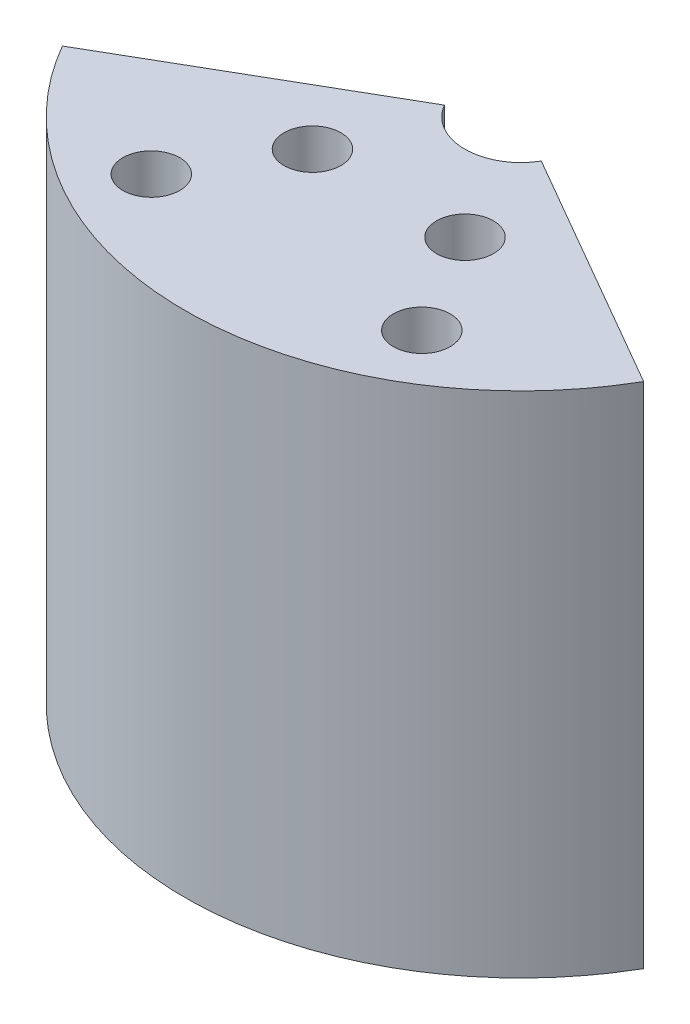
ISO-10303-21;
HEADER;
FILE_DESCRIPTION(('STEP AP214'),'2;1');
FILE_NAME('part.step','',(''),(''),'','','');
FILE_SCHEMA(('AUTOMOTIVE_DESIGN { 1 0 10303 214 1 1 1 1 }'));
ENDSEC;
DATA;
#1=APPLICATION_CONTEXT('core data for automotive mechanical design processes');
#2=APPLICATION_PROTOCOL_DEFINITION('international standard','automotive_design',2000,#1);
#3=PRODUCT_CONTEXT('',#1,'mechanical');
#4=PRODUCT('Part','Part','',(#3));
#5=PRODUCT_RELATED_PRODUCT_CATEGORY('part','',(#4));
#6=PRODUCT_DEFINITION_FORMATION('','',#4);
#7=PRODUCT_DEFINITION_CONTEXT('part definition',#1,'design');
#8=PRODUCT_DEFINITION('design','',#6,#7);
#9=PRODUCT_DEFINITION_SHAPE('','',#8);
#10=(LENGTH_UNIT() NAMED_UNIT(*) SI_UNIT(.MILLI.,.METRE.));
#11=(NAMED_UNIT(*) PLANE_ANGLE_UNIT() SI_UNIT($,.RADIAN.));
#12=(NAMED_UNIT(*) SI_UNIT($,.STERADIAN.) SOLID_ANGLE_UNIT());
#13=UNCERTAINTY_MEASURE_WITH_UNIT(LENGTH_MEASURE(1.E-05),#10,'distance_accuracy_value','');
#14=(GEOMETRIC_REPRESENTATION_CONTEXT(3) GLOBAL_UNCERTAINTY_ASSIGNED_CONTEXT((#13)) GLOBAL_UNIT_ASSIGNED_CONTEXT((#10,
#11,#12)) REPRESENTATION_CONTEXT('',''));
#15=CARTESIAN_POINT('',(0.,0.,0.));
#16=DIRECTION('',(0.,0.,1.));
#17=DIRECTION('',(1.,0.,0.));
#18=AXIS2_PLACEMENT_3D('',#15,#16,#17);
#19=CARTESIAN_POINT('',(-33.25,-123.736,57.591));
#20=DIRECTION('',(0.,1.,0.));
#21=DIRECTION('',(0.,0.,1.));
#22=AXIS2_PLACEMENT_3D('',#19,#20,#21);
#23=CYLINDRICAL_SURFACE('',#22,6.99984599830596);
#24=CARTESIAN_POINT('',(-33.25,-123.736,57.591));
#25=DIRECTION('',(0.,-1.,0.));
#26=DIRECTION('',(0.,0.,-1.));
#27=AXIS2_PLACEMENT_3D('',#24,#25,#26);
#28=CIRCLE('',#27,6.99984599830596);
#29=CARTESIAN_POINT('',(-33.25,-123.736,50.591154001694));
#30=VERTEX_POINT('',#29);
#31=EDGE_CURVE('E124',#30,#30,#28,.T.);
#32=ORIENTED_EDGE('',*,*,#31,.T.);
#33=EDGE_LOOP('',(#32));
#34=FACE_BOUND('',#33,.T.);
#35=CARTESIAN_POINT('',(-33.25,1.25599999999999,57.591));
#36=DIRECTION('',(0.,1.,0.));
#37=DIRECTION('',(-1.,0.,0.));
#38=AXIS2_PLACEMENT_3D('',#35,#36,#37);
#39=CIRCLE('',#38,6.99984599830596);
#40=CARTESIAN_POINT('',(-40.249845998306,1.25599999999999,57.591));
#41=VERTEX_POINT('',#40);
#42=EDGE_CURVE('E101',#41,#41,#39,.T.);
#43=ORIENTED_EDGE('',*,*,#42,.T.);
#44=EDGE_LOOP('',(#43));
#45=FACE_BOUND('',#44,.T.);
#46=ADVANCED_FACE('F36',(#34,#45),#23,.F.);
#47=CARTESIAN_POINT('',(-71.447,-123.736,41.25));
#48=DIRECTION('',(0.500001552615496,0.,0.866024507379608));
#49=DIRECTION('',(0.866024507379608,0.,-0.500001552615496));
#50=AXIS2_PLACEMENT_3D('',#47,#48,#49);
#51=PLANE('',#50);
#52=DIRECTION('',(-0.866024507379608,0.,0.500001552615496));
#53=VECTOR('',#52,1.);
#54=CARTESIAN_POINT('',(-71.447,1.25599999999999,41.25));
#55=LINE('',#54,#53);
#56=CARTESIAN_POINT('',(-11.908,1.256,6.875));
#57=VERTEX_POINT('',#56);
#58=CARTESIAN_POINT('',(-71.447,1.25599999999999,41.25));
#59=VERTEX_POINT('',#58);
#60=EDGE_CURVE('E83',#57,#59,#55,.T.);
#61=ORIENTED_EDGE('',*,*,#60,.F.);
#62=DIRECTION('',(0.,1.,0.));
#63=VECTOR('',#62,1.);
#64=CARTESIAN_POINT('',(-11.908,-123.736,6.875));
#65=LINE('',#64,#63);
#66=CARTESIAN_POINT('',(-11.908,-123.736,6.875));
#67=VERTEX_POINT('',#66);
#68=EDGE_CURVE('E53',#67,#57,#65,.T.);
#69=ORIENTED_EDGE('',*,*,#68,.F.);
#70=DIRECTION('',(0.866024507379608,0.,-0.500001552615496));
#71=VECTOR('',#70,1.);
#72=CARTESIAN_POINT('',(-71.447,-123.736,41.25));
#73=LINE('',#72,#71);
#74=CARTESIAN_POINT('',(-71.447,-123.736,41.25));
#75=VERTEX_POINT('',#74);
#76=EDGE_CURVE('E45',#75,#67,#73,.T.);
#77=ORIENTED_EDGE('',*,*,#76,.F.);
#78=DIRECTION('',(0.,1.,0.));
#79=VECTOR('',#78,1.);
#80=CARTESIAN_POINT('',(-71.447,-123.736,41.25));
#81=LINE('',#80,#79);
#82=EDGE_CURVE('E79',#75,#59,#81,.T.);
#83=ORIENTED_EDGE('',*,*,#82,.T.);
#84=EDGE_LOOP('',(#61,#69,#77,#83));
#85=FACE_BOUND('',#84,.T.);
#86=ADVANCED_FACE('F81',(#85),#51,.F.);
#87=CARTESIAN_POINT('',(71.447,-123.736,41.25));
#88=CARTESIAN_POINT('',(70.4179784412917,-123.736,42.9492691991551));
#89=CARTESIAN_POINT('',(68.3601225616234,-123.736,46.3474984034197));
#90=CARTESIAN_POINT('',(64.8175316162057,-123.736,51.1464276983898));
#91=CARTESIAN_POINT('',(60.9633721752455,-123.736,55.6937957428081));
#92=CARTESIAN_POINT('',(56.784268218965,-123.736,59.9470190573319));
#93=CARTESIAN_POINT('',(52.3103170379407,-123.736,63.8873868401639));
#94=CARTESIAN_POINT('',(47.5641506642531,-123.736,67.4956768649826));
#95=CARTESIAN_POINT('',(42.5700874237951,-123.736,70.7526081931362));
#96=CARTESIAN_POINT('',(37.3536374394381,-123.736,73.6398244219125));
#97=CARTESIAN_POINT('',(31.9426945070306,-123.736,76.1434120966261));
#98=CARTESIAN_POINT('',(26.3648697660876,-123.736,78.2488191827297));
#99=CARTESIAN_POINT('',(20.6500633584446,-123.736,79.9472428229244));
#100=CARTESIAN_POINT('',(14.827753312135,-123.736,81.2299744352066));
#101=CARTESIAN_POINT('',(8.92753089676732,-123.736,82.0871009758009));
#102=CARTESIAN_POINT('',(2.98111809599237,-123.736,82.517756601325));
#103=CARTESIAN_POINT('',(-2.98111809599237,-123.736,82.517756601325));
#104=CARTESIAN_POINT('',(-8.92753089676732,-123.736,82.0871009758009));
#105=CARTESIAN_POINT('',(-14.827753312135,-123.736,81.2299744352066));
#106=CARTESIAN_POINT('',(-20.6500633584446,-123.736,79.9472428229244));
#107=CARTESIAN_POINT('',(-26.3648697660876,-123.736,78.2488191827297));
#108=CARTESIAN_POINT('',(-31.9426945070306,-123.736,76.1434120966261));
#109=CARTESIAN_POINT('',(-37.3536374394382,-123.736,73.6398244219125));
#110=CARTESIAN_POINT('',(-42.5700874237951,-123.736,70.7526081931362));
#111=CARTESIAN_POINT('',(-47.5641506642531,-123.736,67.4956768649826));
#112=CARTESIAN_POINT('',(-52.3103170379407,-123.736,63.8873868401639));
#113=CARTESIAN_POINT('',(-56.784268218965,-123.736,59.9470190573319));
#114=CARTESIAN_POINT('',(-60.9633721752455,-123.736,55.6937957428081));
#115=CARTESIAN_POINT('',(-64.8175316162057,-123.736,51.1464276983898));
#116=CARTESIAN_POINT('',(-68.3601225616235,-123.736,46.3474984034197));
#117=CARTESIAN_POINT('',(-70.4179784412917,-123.736,42.9492691991551));
#118=CARTESIAN_POINT('',(-71.447,-123.736,41.25));
#119=B_SPLINE_CURVE_WITH_KNOTS('',3,(#87,#88,#89,#90,#91,#92,#93,#94,#95,#96,#97,#98,#99,#100,
#101,#102,#103,#104,#105,#106,#107,#108,#109,#110,#111,#112,#113,#114,#115,#116,#117,#118),
.UNSPECIFIED.,.F.,.F.,(4,1,1,1,1,1,1,1,1,1,1,1,1,1,1,1,1,1,1,1,1,1,1,1,1,1,1,1,1,4),(0.,
0.0344839191298283,0.0689615636667485,0.103450465991406,0.137933366239594,0.172414368090567,
0.206896205696217,0.241380971684728,0.275865520494595,0.310346020883038,0.344829100421595,
0.379311579406632,0.413791405821834,0.448274645214702,0.482761183563026,0.517238816436974,
0.551725354785297,0.586208594178166,0.620688420593368,0.655170899578405,0.689653979116962,
0.724134479505404,0.758619028315272,0.793103794303783,0.827585631909433,0.862066633760406,
0.896549534008594,0.931038436333251,0.965516080870172,1.),.UNSPECIFIED.);
#120=DIRECTION('',(0.,1.,0.));
#121=VECTOR('',#120,1.);
#122=SURFACE_OF_LINEAR_EXTRUSION('',#119,#121);
#123=CARTESIAN_POINT('',(71.447,1.25599999999998,41.25));
#124=CARTESIAN_POINT('',(70.4179784412917,1.25599999999999,42.9492691991551));
#125=CARTESIAN_POINT('',(68.3601225616234,1.25599999999999,46.3474984034197));
#126=CARTESIAN_POINT('',(64.8175316162057,1.25599999999994,51.1464276983898));
#127=CARTESIAN_POINT('',(60.9633721752455,1.25600000000001,55.6937957428081));
#128=CARTESIAN_POINT('',(56.784268218965,1.25599999999999,59.9470190573319));
#129=CARTESIAN_POINT('',(52.3103170379407,1.25599999999997,63.8873868401639));
#130=CARTESIAN_POINT('',(47.5641506642531,1.25599999999995,67.4956768649826));
#131=CARTESIAN_POINT('',(42.5700874237951,1.25599999999997,70.7526081931362));
#132=CARTESIAN_POINT('',(37.3536374394381,1.25600000000001,73.6398244219125));
#133=CARTESIAN_POINT('',(31.9426945070306,1.25599999999999,76.1434120966261));
#134=CARTESIAN_POINT('',(26.3648697660876,1.25599999999997,78.2488191827297));
#135=CARTESIAN_POINT('',(20.6500633584446,1.25599999999999,79.9472428229244));
#136=CARTESIAN_POINT('',(14.827753312135,1.25599999999999,81.2299744352066));
#137=CARTESIAN_POINT('',(8.92753089676732,1.25599999999994,82.0871009758009));
#138=CARTESIAN_POINT('',(2.98111809599237,1.25599999999999,82.517756601325));
#139=CARTESIAN_POINT('',(-2.98111809599237,1.25599999999997,82.517756601325));
#140=CARTESIAN_POINT('',(-8.92753089676732,1.25599999999997,82.0871009758009));
#141=CARTESIAN_POINT('',(-14.827753312135,1.25599999999998,81.2299744352066));
#142=CARTESIAN_POINT('',(-20.6500633584446,1.25599999999995,79.9472428229244));
#143=CARTESIAN_POINT('',(-26.3648697660876,1.25600000000002,78.2488191827297));
#144=CARTESIAN_POINT('',(-31.9426945070306,1.25600000000001,76.1434120966261));
#145=CARTESIAN_POINT('',(-37.3536374394382,1.25599999999995,73.6398244219125));
#146=CARTESIAN_POINT('',(-42.5700874237951,1.25599999999999,70.7526081931362));
#147=CARTESIAN_POINT('',(-47.5641506642531,1.25599999999995,67.4956768649826));
#148=CARTESIAN_POINT('',(-52.3103170379407,1.25599999999995,63.8873868401639));
#149=CARTESIAN_POINT('',(-56.784268218965,1.25599999999998,59.9470190573319));
#150=CARTESIAN_POINT('',(-60.9633721752455,1.25599999999998,55.6937957428081));
#151=CARTESIAN_POINT('',(-64.8175316162057,1.25600000000002,51.1464276983898));
#152=CARTESIAN_POINT('',(-68.3601225616235,1.25599999999994,46.3474984034197));
#153=CARTESIAN_POINT('',(-70.4179784412917,1.25599999999997,42.9492691991551));
#154=CARTESIAN_POINT('',(-71.447,1.25599999999998,41.25));
#155=B_SPLINE_CURVE_WITH_KNOTS('',3,(#123,#124,#125,#126,#127,#128,#129,#130,#131,#132,#133,
#134,#135,#136,#137,#138,#139,#140,#141,#142,#143,#144,#145,#146,#147,#148,#149,#150,#151,#152,
#153,#154),.UNSPECIFIED.,.F.,.F.,(4,1,1,1,1,1,1,1,1,1,1,1,1,1,1,1,1,1,1,1,1,1,1,1,1,1,1,1,1,4),
(0.,0.0344839191298283,0.0689615636667485,0.103450465991406,0.137933366239594,0.172414368090567,
0.206896205696217,0.241380971684728,0.275865520494595,0.310346020883038,0.344829100421595,
0.379311579406632,0.413791405821834,0.448274645214702,0.482761183563026,0.517238816436974,
0.551725354785297,0.586208594178166,0.620688420593368,0.655170899578405,0.689653979116962,
0.724134479505404,0.758619028315272,0.793103794303783,0.827585631909433,0.862066633760406,
0.896549534008594,0.931038436333251,0.965516080870172,1.),.UNSPECIFIED.);
#156=CARTESIAN_POINT('',(71.447,1.25600000002747,41.25));
#157=VERTEX_POINT('',#156);
#158=EDGE_CURVE('E89',#59,#157,#155,.F.);
#159=ORIENTED_EDGE('',*,*,#158,.F.);
#160=ORIENTED_EDGE('',*,*,#82,.F.);
#161=CARTESIAN_POINT('',(71.447,-123.736,41.25));
#162=VERTEX_POINT('',#161);
#163=EDGE_CURVE('E12',#162,#75,#119,.T.);
#164=ORIENTED_EDGE('',*,*,#163,.F.);
#165=DIRECTION('',(0.,1.,0.));
#166=VECTOR('',#165,1.);
#167=CARTESIAN_POINT('',(71.447,-123.736,41.25));
#168=LINE('',#167,#166);
#169=EDGE_CURVE('E92',#162,#157,#168,.T.);
#170=ORIENTED_EDGE('',*,*,#169,.T.);
#171=EDGE_LOOP('',(#159,#160,#164,#170));
#172=FACE_BOUND('',#171,.T.);
#173=ADVANCED_FACE('F90',(#172),#122,.F.);
#174=CARTESIAN_POINT('',(11.908,-123.736,6.875));
#175=CARTESIAN_POINT('',(11.7366156273442,-123.736,7.15815049054757));
#176=CARTESIAN_POINT('',(11.3937459960641,-123.736,7.72461814910006));
#177=CARTESIAN_POINT('',(10.8023525761079,-123.736,8.52353002394046));
#178=CARTESIAN_POINT('',(10.1613750644199,-123.736,9.28259600836447));
#179=CARTESIAN_POINT('',(9.46376369961801,-123.736,9.99048751098942));
#180=CARTESIAN_POINT('',(8.71883966135122,-123.736,10.6481602295829));
#181=CARTESIAN_POINT('',(7.92790824386578,-123.736,11.2500288289471));
#182=CARTESIAN_POINT('',(7.09497561642224,-123.736,11.7920987309621));
#183=CARTESIAN_POINT('',(6.2257995279889,-123.736,12.2738270176543));
#184=CARTESIAN_POINT('',(5.32328208697905,-123.736,12.6898495782074));
#185=CARTESIAN_POINT('',(4.39409998888104,-123.736,13.0411824892666));
#186=CARTESIAN_POINT('',(3.4417651773478,-123.736,13.324929470653));
#187=CARTESIAN_POINT('',(2.47134212385895,-123.736,13.5374844444431));
#188=CARTESIAN_POINT('',(1.48789009038564,-123.736,13.6809419106778));
#189=CARTESIAN_POINT('',(0.496971484172793,-123.736,13.7529903970947));
#190=CARTESIAN_POINT('',(-0.496971484172793,-123.736,13.7529903970947));
#191=CARTESIAN_POINT('',(-1.48789009038564,-123.736,13.6809419106778));
#192=CARTESIAN_POINT('',(-2.47134212385894,-123.736,13.5374844444431));
#193=CARTESIAN_POINT('',(-3.44176517734781,-123.736,13.324929470653));
#194=CARTESIAN_POINT('',(-4.39409998888103,-123.736,13.0411824892666));
#195=CARTESIAN_POINT('',(-5.32328208697906,-123.736,12.6898495782074));
#196=CARTESIAN_POINT('',(-6.22579952798889,-123.736,12.2738270176543));
#197=CARTESIAN_POINT('',(-7.09497561642224,-123.736,11.7920987309621));
#198=CARTESIAN_POINT('',(-7.92790824386578,-123.736,11.2500288289471));
#199=CARTESIAN_POINT('',(-8.71883966135122,-123.736,10.648160229583));
#200=CARTESIAN_POINT('',(-9.46376369961801,-123.736,9.99048751098942));
#201=CARTESIAN_POINT('',(-10.1613750644199,-123.736,9.28259600836447));
#202=CARTESIAN_POINT('',(-10.8023525761079,-123.736,8.52353002394047));
#203=CARTESIAN_POINT('',(-11.3937459960641,-123.736,7.72461814910006));
#204=CARTESIAN_POINT('',(-11.7366156273442,-123.736,7.15815049054756));
#205=CARTESIAN_POINT('',(-11.908,-123.736,6.875));
#206=B_SPLINE_CURVE_WITH_KNOTS('',3,(#174,#175,#176,#177,#178,#179,#180,#181,#182,#183,#184,
#185,#186,#187,#188,#189,#190,#191,#192,#193,#194,#195,#196,#197,#198,#199,#200,#201,#202,#203,
#204,#205),.UNSPECIFIED.,.F.,.F.,(4,1,1,1,1,1,1,1,1,1,1,1,1,1,1,1,1,1,1,1,1,1,1,1,1,1,1,1,1,4),
(0.,0.0344708882662089,0.0689620679329312,0.103436508056392,0.137919117812285,0.172419110023535,
0.206895089754669,0.241383086560245,0.275880421257061,0.310348632265819,0.344841071005323,
0.379302859248072,0.41379577012802,0.448262511181514,0.482772834283755,0.517227165716245,
0.551737488818486,0.58620422987198,0.620697140751928,0.655158928994677,0.689651367734181,
0.724119578742939,0.758616913439755,0.793104910245331,0.827580889976465,0.862080882187716,
0.896563491943608,0.931037932067069,0.965529111733791,1.),.UNSPECIFIED.);
#207=DIRECTION('',(0.,1.,0.));
#208=VECTOR('',#207,1.);
#209=SURFACE_OF_LINEAR_EXTRUSION('',#206,#208);
#210=ORIENTED_EDGE('',*,*,#68,.T.);
#211=CARTESIAN_POINT('',(11.908,1.25600000000001,6.875));
#212=CARTESIAN_POINT('',(11.7366156273442,1.25599999999999,7.15815049054757));
#213=CARTESIAN_POINT('',(11.3937459960641,1.25600000000001,7.72461814910006));
#214=CARTESIAN_POINT('',(10.8023525761079,1.25600000000003,8.52353002394046));
#215=CARTESIAN_POINT('',(10.1613750644199,1.25599999999999,9.28259600836447));
#216=CARTESIAN_POINT('',(9.46376369961801,1.25599999999999,9.99048751098942));
#217=CARTESIAN_POINT('',(8.71883966135122,1.25599999999998,10.6481602295829));
#218=CARTESIAN_POINT('',(7.92790824386578,1.25600000000002,11.2500288289471));
#219=CARTESIAN_POINT('',(7.09497561642224,1.25599999999999,11.7920987309621));
#220=CARTESIAN_POINT('',(6.2257995279889,1.25599999999997,12.2738270176543));
#221=CARTESIAN_POINT('',(5.32328208697905,1.25599999999999,12.6898495782074));
#222=CARTESIAN_POINT('',(4.39409998888104,1.25599999999999,13.0411824892666));
#223=CARTESIAN_POINT('',(3.4417651773478,1.25600000000002,13.324929470653));
#224=CARTESIAN_POINT('',(2.47134212385895,1.25600000000002,13.5374844444431));
#225=CARTESIAN_POINT('',(1.48789009038564,1.25600000000001,13.6809419106778));
#226=CARTESIAN_POINT('',(0.496971484172793,1.25599999999999,13.7529903970947));
#227=CARTESIAN_POINT('',(-0.496971484172793,1.25599999999998,13.7529903970947));
#228=CARTESIAN_POINT('',(-1.48789009038564,1.25599999999999,13.6809419106778));
#229=CARTESIAN_POINT('',(-2.47134212385894,1.25600000000001,13.5374844444431));
#230=CARTESIAN_POINT('',(-3.44176517734781,1.25600000000001,13.324929470653));
#231=CARTESIAN_POINT('',(-4.39409998888103,1.25600000000002,13.0411824892666));
#232=CARTESIAN_POINT('',(-5.32328208697906,1.25599999999998,12.6898495782074));
#233=CARTESIAN_POINT('',(-6.22579952798889,1.25600000000003,12.2738270176543));
#234=CARTESIAN_POINT('',(-7.09497561642224,1.25599999999997,11.7920987309621));
#235=CARTESIAN_POINT('',(-7.92790824386578,1.25600000000003,11.2500288289471));
#236=CARTESIAN_POINT('',(-8.71883966135122,1.25599999999998,10.648160229583));
#237=CARTESIAN_POINT('',(-9.46376369961801,1.25600000000001,9.99048751098942));
#238=CARTESIAN_POINT('',(-10.1613750644199,1.25600000000002,9.28259600836447));
#239=CARTESIAN_POINT('',(-10.8023525761079,1.25599999999997,8.52353002394047));
#240=CARTESIAN_POINT('',(-11.3937459960641,1.25600000000003,7.72461814910006));
#241=CARTESIAN_POINT('',(-11.7366156273442,1.25600000000003,7.15815049054756));
#242=CARTESIAN_POINT('',(-11.908,1.25600000000001,6.875));
#243=B_SPLINE_CURVE_WITH_KNOTS('',3,(#211,#212,#213,#214,#215,#216,#217,#218,#219,#220,#221,
#222,#223,#224,#225,#226,#227,#228,#229,#230,#231,#232,#233,#234,#235,#236,#237,#238,#239,#240,
#241,#242),.UNSPECIFIED.,.F.,.F.,(4,1,1,1,1,1,1,1,1,1,1,1,1,1,1,1,1,1,1,1,1,1,1,1,1,1,1,1,1,4),
(0.,0.0344708882662089,0.0689620679329312,0.103436508056392,0.137919117812285,0.172419110023535,
0.206895089754669,0.241383086560245,0.275880421257061,0.310348632265819,0.344841071005323,
0.379302859248072,0.41379577012802,0.448262511181514,0.482772834283755,0.517227165716245,
0.551737488818486,0.58620422987198,0.620697140751928,0.655158928994677,0.689651367734181,
0.724119578742939,0.758616913439755,0.793104910245331,0.827580889976465,0.862080882187716,
0.896563491943608,0.931037932067069,0.965529111733791,1.),.UNSPECIFIED.);
#244=CARTESIAN_POINT('',(11.908,1.25599999997603,6.875));
#245=VERTEX_POINT('',#244);
#246=EDGE_CURVE('E58',#57,#245,#243,.F.);
#247=ORIENTED_EDGE('',*,*,#246,.T.);
#248=DIRECTION('',(0.,1.,0.));
#249=VECTOR('',#248,1.);
#250=CARTESIAN_POINT('',(11.908,-123.736,6.875));
#251=LINE('',#250,#249);
#252=CARTESIAN_POINT('',(11.908,-123.736,6.875));
#253=VERTEX_POINT('',#252);
#254=EDGE_CURVE('E150',#253,#245,#251,.T.);
#255=ORIENTED_EDGE('',*,*,#254,.F.);
#256=EDGE_CURVE('E147',#253,#67,#206,.T.);
#257=ORIENTED_EDGE('',*,*,#256,.T.);
#258=EDGE_LOOP('',(#210,#247,#255,#257));
#259=FACE_BOUND('',#258,.T.);
#260=ADVANCED_FACE('F143',(#259),#209,.T.);
#261=CARTESIAN_POINT('',(71.447,-123.736,41.25));
#262=DIRECTION('',(0.500001552615496,0.,-0.866024507379608));
#263=DIRECTION('',(-0.866024507379608,0.,-0.500001552615496));
#264=AXIS2_PLACEMENT_3D('',#261,#262,#263);
#265=PLANE('',#264);
#266=ORIENTED_EDGE('',*,*,#254,.T.);
#267=DIRECTION('',(0.866024507379608,0.,0.500001552615496));
#268=VECTOR('',#267,1.);
#269=CARTESIAN_POINT('',(71.447,1.25600000000001,41.25));
#270=LINE('',#269,#268);
#271=EDGE_CURVE('E113',#245,#157,#270,.T.);
#272=ORIENTED_EDGE('',*,*,#271,.T.);
#273=ORIENTED_EDGE('',*,*,#169,.F.);
#274=DIRECTION('',(-0.866024507379608,0.,-0.500001552615496));
#275=VECTOR('',#274,1.);
#276=CARTESIAN_POINT('',(71.447,-123.736,41.25));
#277=LINE('',#276,#275);
#278=EDGE_CURVE('E153',#162,#253,#277,.T.);
#279=ORIENTED_EDGE('',*,*,#278,.T.);
#280=EDGE_LOOP('',(#266,#272,#273,#279));
#281=FACE_BOUND('',#280,.T.);
#282=ADVANCED_FACE('F169',(#281),#265,.T.);
#283=CARTESIAN_POINT('',(-18.75,-123.736,32.476));
#284=DIRECTION('',(0.,1.,0.));
#285=DIRECTION('',(0.,0.,1.));
#286=AXIS2_PLACEMENT_3D('',#283,#284,#285);
#287=CYLINDRICAL_SURFACE('',#286,6.99984599830597);
#288=CARTESIAN_POINT('',(-18.75,-123.736,32.476));
#289=DIRECTION('',(0.,-1.,0.));
#290=DIRECTION('',(0.,0.,-1.));
#291=AXIS2_PLACEMENT_3D('',#288,#289,#290);
#292=CIRCLE('',#291,6.99984599830597);
#293=CARTESIAN_POINT('',(-18.75,-123.736,25.476154001694));
#294=VERTEX_POINT('',#293);
#295=EDGE_CURVE('E127',#294,#294,#292,.T.);
#296=ORIENTED_EDGE('',*,*,#295,.T.);
#297=EDGE_LOOP('',(#296));
#298=FACE_BOUND('',#297,.T.);
#299=CARTESIAN_POINT('',(-18.75,1.25599999999999,32.476));
#300=DIRECTION('',(0.,1.,0.));
#301=DIRECTION('',(-1.,0.,0.));
#302=AXIS2_PLACEMENT_3D('',#299,#300,#301);
#303=CIRCLE('',#302,6.99984599830597);
#304=CARTESIAN_POINT('',(-25.749845998306,1.25599999999999,32.476));
#305=VERTEX_POINT('',#304);
#306=EDGE_CURVE('E98',#305,#305,#303,.T.);
#307=ORIENTED_EDGE('',*,*,#306,.T.);
#308=EDGE_LOOP('',(#307));
#309=FACE_BOUND('',#308,.T.);
#310=ADVANCED_FACE('F174',(#298,#309),#287,.F.);
#311=CARTESIAN_POINT('',(18.75,-123.736,32.476));
#312=DIRECTION('',(0.,1.,0.));
#313=DIRECTION('',(0.,0.,1.));
#314=AXIS2_PLACEMENT_3D('',#311,#312,#313);
#315=CYLINDRICAL_SURFACE('',#314,6.99984599830597);
#316=CARTESIAN_POINT('',(18.75,-123.736,32.476));
#317=DIRECTION('',(0.,-1.,0.));
#318=DIRECTION('',(0.,0.,-1.));
#319=AXIS2_PLACEMENT_3D('',#316,#317,#318);
#320=CIRCLE('',#319,6.99984599830597);
#321=CARTESIAN_POINT('',(18.75,-123.736,25.476154001694));
#322=VERTEX_POINT('',#321);
#323=EDGE_CURVE('E121',#322,#322,#320,.T.);
#324=ORIENTED_EDGE('',*,*,#323,.T.);
#325=EDGE_LOOP('',(#324));
#326=FACE_BOUND('',#325,.T.);
#327=CARTESIAN_POINT('',(18.75,1.25599999999999,32.476));
#328=DIRECTION('',(0.,1.,0.));
#329=DIRECTION('',(-1.,0.,0.));
#330=AXIS2_PLACEMENT_3D('',#327,#328,#329);
#331=CIRCLE('',#330,6.99984599830597);
#332=CARTESIAN_POINT('',(11.750154001694,1.25599999999999,32.476));
#333=VERTEX_POINT('',#332);
#334=EDGE_CURVE('E205',#333,#333,#331,.T.);
#335=ORIENTED_EDGE('',*,*,#334,.T.);
#336=EDGE_LOOP('',(#335));
#337=FACE_BOUND('',#336,.T.);
#338=ADVANCED_FACE('F184',(#326,#337),#315,.F.);
#339=CARTESIAN_POINT('',(0.,-123.736,-83.9124205601942));
#340=DIRECTION('',(0.,-1.,0.));
#341=DIRECTION('',(0.,0.,-1.));
#342=AXIS2_PLACEMENT_3D('',#339,#340,#341);
#343=PLANE('',#342);
#344=ORIENTED_EDGE('',*,*,#323,.F.);
#345=EDGE_LOOP('',(#344));
#346=FACE_BOUND('',#345,.T.);
#347=ORIENTED_EDGE('',*,*,#295,.F.);
#348=EDGE_LOOP('',(#347));
#349=FACE_BOUND('',#348,.T.);
#350=ORIENTED_EDGE('',*,*,#278,.F.);
#351=ORIENTED_EDGE('',*,*,#163,.T.);
#352=ORIENTED_EDGE('',*,*,#76,.T.);
#353=ORIENTED_EDGE('',*,*,#256,.F.);
#354=EDGE_LOOP('',(#350,#351,#352,#353));
#355=FACE_BOUND('',#354,.T.);
#356=ORIENTED_EDGE('',*,*,#31,.F.);
#357=EDGE_LOOP('',(#356));
#358=FACE_BOUND('',#357,.T.);
#359=CARTESIAN_POINT('',(33.25,-123.736,57.591));
#360=DIRECTION('',(0.,-1.,0.));
#361=DIRECTION('',(0.,0.,-1.));
#362=AXIS2_PLACEMENT_3D('',#359,#360,#361);
#363=CIRCLE('',#362,6.99984599830596);
#364=CARTESIAN_POINT('',(33.25,-123.736,50.591154001694));
#365=VERTEX_POINT('',#364);
#366=EDGE_CURVE('E118',#365,#365,#363,.T.);
#367=ORIENTED_EDGE('',*,*,#366,.F.);
#368=EDGE_LOOP('',(#367));
#369=FACE_BOUND('',#368,.T.);
#370=ADVANCED_FACE('F38',(#346,#349,#355,#358,#369),#343,.T.);
#371=CARTESIAN_POINT('',(33.25,-123.736,57.591));
#372=DIRECTION('',(0.,1.,0.));
#373=DIRECTION('',(0.,0.,1.));
#374=AXIS2_PLACEMENT_3D('',#371,#372,#373);
#375=CYLINDRICAL_SURFACE('',#374,6.99984599830596);
#376=ORIENTED_EDGE('',*,*,#366,.T.);
#377=EDGE_LOOP('',(#376));
#378=FACE_BOUND('',#377,.T.);
#379=CARTESIAN_POINT('',(33.25,1.25599999999999,57.591));
#380=DIRECTION('',(0.,1.,0.));
#381=DIRECTION('',(-1.,0.,0.));
#382=AXIS2_PLACEMENT_3D('',#379,#380,#381);
#383=CIRCLE('',#382,6.99984599830596);
#384=CARTESIAN_POINT('',(26.250154001694,1.25599999999999,57.591));
#385=VERTEX_POINT('',#384);
#386=EDGE_CURVE('E40',#385,#385,#383,.T.);
#387=ORIENTED_EDGE('',*,*,#386,.T.);
#388=EDGE_LOOP('',(#387));
#389=FACE_BOUND('',#388,.T.);
#390=ADVANCED_FACE('F197',(#378,#389),#375,.F.);
#391=CARTESIAN_POINT('',(0.,1.256,0.));
#392=DIRECTION('',(0.,1.,0.));
#393=DIRECTION('',(-1.,0.,0.));
#394=AXIS2_PLACEMENT_3D('',#391,#392,#393);
#395=PLANE('',#394);
#396=ORIENTED_EDGE('',*,*,#271,.F.);
#397=ORIENTED_EDGE('',*,*,#246,.F.);
#398=ORIENTED_EDGE('',*,*,#60,.T.);
#399=ORIENTED_EDGE('',*,*,#158,.T.);
#400=EDGE_LOOP('',(#396,#397,#398,#399));
#401=FACE_BOUND('',#400,.T.);
#402=ORIENTED_EDGE('',*,*,#306,.F.);
#403=EDGE_LOOP('',(#402));
#404=FACE_BOUND('',#403,.T.);
#405=ORIENTED_EDGE('',*,*,#42,.F.);
#406=EDGE_LOOP('',(#405));
#407=FACE_BOUND('',#406,.T.);
#408=ORIENTED_EDGE('',*,*,#334,.F.);
#409=EDGE_LOOP('',(#408));
#410=FACE_BOUND('',#409,.T.);
#411=ORIENTED_EDGE('',*,*,#386,.F.);
#412=EDGE_LOOP('',(#411));
#413=FACE_BOUND('',#412,.T.);
#414=ADVANCED_FACE('F96',(#401,#404,#407,#410,#413),#395,.T.);
#415=CLOSED_SHELL('',(#46,#86,#173,#260,#282,#310,#338,#370,#390,#414));
#416=MANIFOLD_SOLID_BREP('B2',#415);
#417=ADVANCED_BREP_SHAPE_REPRESENTATION('',(#18,#416),#14);
#418=SHAPE_DEFINITION_REPRESENTATION(#9,#417);
ENDSEC;
END-ISO-10303-21;
